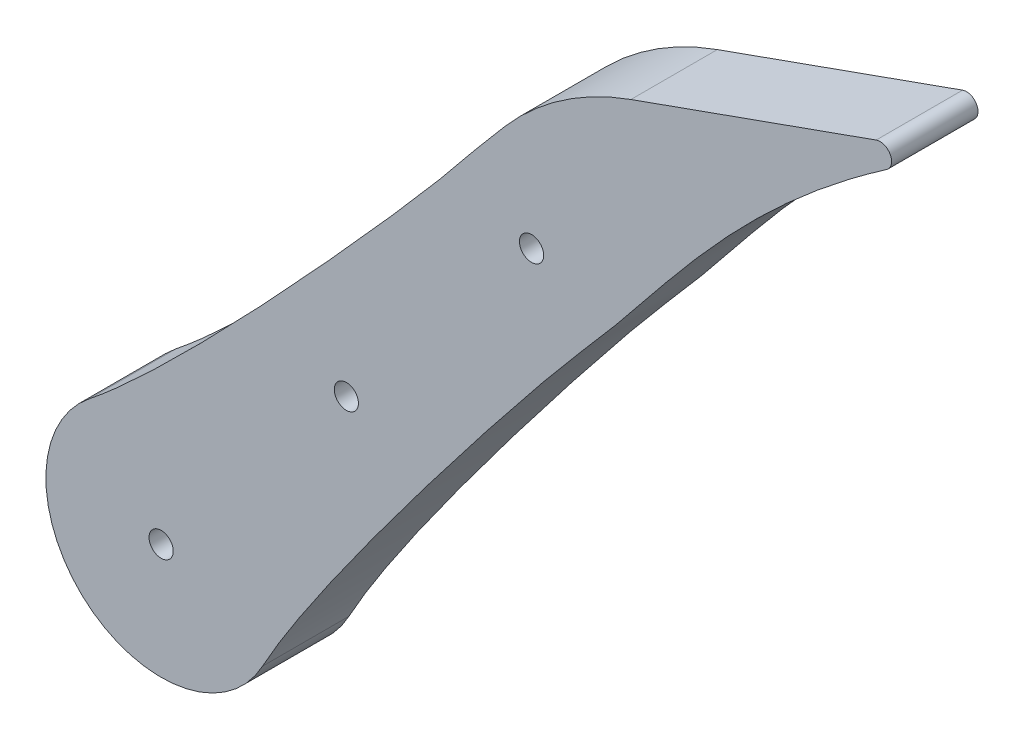
ISO-10303-21;
HEADER;
FILE_DESCRIPTION(('STEP AP214'),'2;1');
FILE_NAME('part.step','',(''),(''),'','','');
FILE_SCHEMA(('AUTOMOTIVE_DESIGN { 1 0 10303 214 1 1 1 1 }'));
ENDSEC;
DATA;
#1=APPLICATION_CONTEXT('core data for automotive mechanical design processes');
#2=APPLICATION_PROTOCOL_DEFINITION('international standard','automotive_design',2000,#1);
#3=PRODUCT_CONTEXT('',#1,'mechanical');
#4=PRODUCT('Part','Part','',(#3));
#5=PRODUCT_RELATED_PRODUCT_CATEGORY('part','',(#4));
#6=PRODUCT_DEFINITION_FORMATION('','',#4);
#7=PRODUCT_DEFINITION_CONTEXT('part definition',#1,'design');
#8=PRODUCT_DEFINITION('design','',#6,#7);
#9=PRODUCT_DEFINITION_SHAPE('','',#8);
#10=(LENGTH_UNIT() NAMED_UNIT(*) SI_UNIT(.MILLI.,.METRE.));
#11=(NAMED_UNIT(*) PLANE_ANGLE_UNIT() SI_UNIT($,.RADIAN.));
#12=(NAMED_UNIT(*) SI_UNIT($,.STERADIAN.) SOLID_ANGLE_UNIT());
#13=UNCERTAINTY_MEASURE_WITH_UNIT(LENGTH_MEASURE(1.E-05),#10,'distance_accuracy_value','');
#14=(GEOMETRIC_REPRESENTATION_CONTEXT(3) GLOBAL_UNCERTAINTY_ASSIGNED_CONTEXT((#13)) GLOBAL_UNIT_ASSIGNED_CONTEXT((#10,
#11,#12)) REPRESENTATION_CONTEXT('',''));
#15=CARTESIAN_POINT('',(0.,0.,0.));
#16=DIRECTION('',(0.,0.,1.));
#17=DIRECTION('',(1.,0.,0.));
#18=AXIS2_PLACEMENT_3D('',#15,#16,#17);
#19=CARTESIAN_POINT('',(76.5989589468399,-175.143739229266,31.));
#20=DIRECTION('',(0.,0.,1.));
#21=DIRECTION('',(1.,0.,0.));
#22=AXIS2_PLACEMENT_3D('',#19,#20,#21);
#23=PLANE('',#22);
#24=CARTESIAN_POINT('',(77.439461008357,-195.520152103908,31.));
#25=DIRECTION('',(0.,0.,1.));
#26=DIRECTION('',(1.,0.,0.));
#27=AXIS2_PLACEMENT_3D('',#24,#25,#26);
#28=CIRCLE('',#27,2.1);
#29=CARTESIAN_POINT('',(79.539461008357,-195.520152103908,31.));
#30=VERTEX_POINT('',#29);
#31=EDGE_CURVE('E140',#30,#30,#28,.T.);
#32=ORIENTED_EDGE('',*,*,#31,.F.);
#33=EDGE_LOOP('',(#32));
#34=FACE_BOUND('',#33,.T.);
#35=CARTESIAN_POINT('',(45.3000805240301,-233.822374259857,31.));
#36=DIRECTION('',(0.,0.,1.));
#37=DIRECTION('',(1.,0.,0.));
#38=AXIS2_PLACEMENT_3D('',#35,#36,#37);
#39=CIRCLE('',#38,2.09999999999999);
#40=CARTESIAN_POINT('',(47.4000805240301,-233.822374259857,31.));
#41=VERTEX_POINT('',#40);
#42=EDGE_CURVE('E218',#41,#41,#39,.T.);
#43=ORIENTED_EDGE('',*,*,#42,.F.);
#44=EDGE_LOOP('',(#43));
#45=FACE_BOUND('',#44,.T.);
#46=CARTESIAN_POINT('',(13.1607000397032,-272.124596415806,31.));
#47=DIRECTION('',(0.,0.,1.));
#48=DIRECTION('',(1.,0.,0.));
#49=AXIS2_PLACEMENT_3D('',#46,#47,#48);
#50=CIRCLE('',#49,2.09999999999999);
#51=CARTESIAN_POINT('',(15.2607000397032,-272.124596415806,31.));
#52=VERTEX_POINT('',#51);
#53=EDGE_CURVE('E226',#52,#52,#50,.T.);
#54=ORIENTED_EDGE('',*,*,#53,.F.);
#55=EDGE_LOOP('',(#54));
#56=FACE_BOUND('',#55,.T.);
#57=DIRECTION('',(-0.941840114679676,-0.336061301521278,0.));
#58=VECTOR('',#57,1.);
#59=CARTESIAN_POINT('',(62.7645024964508,-175.902806903005,31.));
#60=LINE('',#59,#58);
#61=CARTESIAN_POINT('',(137.236577428129,-149.33016252478,31.));
#62=VERTEX_POINT('',#61);
#63=CARTESIAN_POINT('',(94.678723233749,-164.515380957933,31.));
#64=VERTEX_POINT('',#63);
#65=EDGE_CURVE('E129',#62,#64,#60,.T.);
#66=ORIENTED_EDGE('',*,*,#65,.T.);
#67=CARTESIAN_POINT('',(112.153910912855,-213.491066921276,31.));
#68=DIRECTION('',(0.,0.,1.));
#69=DIRECTION('',(1.,0.,0.));
#70=AXIS2_PLACEMENT_3D('',#67,#68,#69);
#71=CIRCLE('',#70,52.);
#72=CARTESIAN_POINT('',(72.8806540117309,-179.408647811443,31.));
#73=VERTEX_POINT('',#72);
#74=EDGE_CURVE('E62',#64,#73,#71,.T.);
#75=ORIENTED_EDGE('',*,*,#74,.T.);
#76=CARTESIAN_POINT('',(115.704809965513,-109.996492831036,31.));
#77=CARTESIAN_POINT('',(101.948797579582,-150.116707378643,31.));
#78=CARTESIAN_POINT('',(78.1787907914669,-171.772825460758,31.));
#79=CARTESIAN_POINT('',(58.7170794777346,-197.082387324868,31.));
#80=CARTESIAN_POINT('',(16.3569995422659,-244.049515563768,31.));
#81=CARTESIAN_POINT('',(0.724486189959749,-256.461244760319,31.));
#82=B_SPLINE_CURVE_WITH_KNOTS('',3,(#76,#77,#78,#79,#80,#81),.UNSPECIFIED.,.F.,.F.,(4,1,1,4),
(0.,0.619090324128096,0.719090324128096,1.),.UNSPECIFIED.);
#83=CARTESIAN_POINT('',(0.724486189959779,-256.461244760319,31.));
#84=VERTEX_POINT('',#83);
#85=EDGE_CURVE('E88',#73,#84,#82,.T.);
#86=ORIENTED_EDGE('',*,*,#85,.T.);
#87=CARTESIAN_POINT('',(13.1607000397032,-272.124596415806,31.));
#88=DIRECTION('',(0.,0.,1.));
#89=DIRECTION('',(1.,0.,0.));
#90=AXIS2_PLACEMENT_3D('',#87,#88,#89);
#91=CIRCLE('',#90,20.);
#92=CARTESIAN_POINT('',(30.7456160602677,-281.651963762019,31.));
#93=VERTEX_POINT('',#92);
#94=EDGE_CURVE('E91',#84,#93,#91,.T.);
#95=ORIENTED_EDGE('',*,*,#94,.T.);
#96=CARTESIAN_POINT('',(30.7456160602677,-281.651963762019,31.));
#97=CARTESIAN_POINT('',(40.2542257453367,-264.101669256925,31.));
#98=CARTESIAN_POINT('',(79.1520670851047,-214.229377889324,31.));
#99=CARTESIAN_POINT('',(100.697629130312,-190.668374405424,31.));
#100=CARTESIAN_POINT('',(117.89712375584,-163.498941991036,31.));
#101=CARTESIAN_POINT('',(155.019115612056,-142.985112199041,31.));
#102=B_SPLINE_CURVE_WITH_KNOTS('',3,(#96,#97,#98,#99,#100,#101),.UNSPECIFIED.,.F.,.F.,(4,1,1,4),
(0.,0.280909675871904,0.380909675871904,1.),.UNSPECIFIED.);
#103=CARTESIAN_POINT('',(139.046001436581,-152.859000957248,31.));
#104=VERTEX_POINT('',#103);
#105=EDGE_CURVE('E103',#93,#104,#102,.T.);
#106=ORIENTED_EDGE('',*,*,#105,.T.);
#107=CARTESIAN_POINT('',(137.908700031171,-151.21384275414,31.));
#108=DIRECTION('',(0.,0.,1.));
#109=DIRECTION('',(1.,0.,0.));
#110=AXIS2_PLACEMENT_3D('',#107,#108,#109);
#111=CIRCLE('',#110,2.);
#112=EDGE_CURVE('E119',#104,#62,#111,.T.);
#113=ORIENTED_EDGE('',*,*,#112,.T.);
#114=EDGE_LOOP('',(#66,#75,#86,#95,#106,#113));
#115=FACE_BOUND('',#114,.T.);
#116=ADVANCED_FACE('F40',(#34,#45,#56,#115),#23,.T.);
#117=CARTESIAN_POINT('',(76.5989589468399,-175.143739229266,16.));
#118=DIRECTION('',(0.,0.,1.));
#119=DIRECTION('',(1.,0.,0.));
#120=AXIS2_PLACEMENT_3D('',#117,#118,#119);
#121=PLANE('',#120);
#122=CARTESIAN_POINT('',(77.439461008357,-195.520152103908,16.));
#123=DIRECTION('',(0.,0.,1.));
#124=DIRECTION('',(1.,0.,0.));
#125=AXIS2_PLACEMENT_3D('',#122,#123,#124);
#126=CIRCLE('',#125,2.1);
#127=CARTESIAN_POINT('',(79.539461008357,-195.520152103908,16.));
#128=VERTEX_POINT('',#127);
#129=EDGE_CURVE('E136',#128,#128,#126,.T.);
#130=ORIENTED_EDGE('',*,*,#129,.T.);
#131=EDGE_LOOP('',(#130));
#132=FACE_BOUND('',#131,.T.);
#133=CARTESIAN_POINT('',(45.3000805240301,-233.822374259857,16.));
#134=DIRECTION('',(0.,0.,1.));
#135=DIRECTION('',(1.,0.,0.));
#136=AXIS2_PLACEMENT_3D('',#133,#134,#135);
#137=CIRCLE('',#136,2.09999999999999);
#138=CARTESIAN_POINT('',(47.4000805240301,-233.822374259857,16.));
#139=VERTEX_POINT('',#138);
#140=EDGE_CURVE('E221',#139,#139,#137,.T.);
#141=ORIENTED_EDGE('',*,*,#140,.T.);
#142=EDGE_LOOP('',(#141));
#143=FACE_BOUND('',#142,.T.);
#144=CARTESIAN_POINT('',(13.1607000397032,-272.124596415806,16.));
#145=DIRECTION('',(0.,0.,1.));
#146=DIRECTION('',(1.,0.,0.));
#147=AXIS2_PLACEMENT_3D('',#144,#145,#146);
#148=CIRCLE('',#147,2.09999999999999);
#149=CARTESIAN_POINT('',(15.2607000397032,-272.124596415806,16.));
#150=VERTEX_POINT('',#149);
#151=EDGE_CURVE('E228',#150,#150,#148,.T.);
#152=ORIENTED_EDGE('',*,*,#151,.T.);
#153=EDGE_LOOP('',(#152));
#154=FACE_BOUND('',#153,.T.);
#155=CARTESIAN_POINT('',(115.704809965513,-109.996492831036,16.));
#156=CARTESIAN_POINT('',(101.948797579582,-150.116707378643,16.));
#157=CARTESIAN_POINT('',(78.1787907914669,-171.772825460758,16.));
#158=CARTESIAN_POINT('',(58.7170794777346,-197.082387324868,16.));
#159=CARTESIAN_POINT('',(16.3569995422659,-244.049515563768,16.));
#160=CARTESIAN_POINT('',(0.724486189959749,-256.461244760319,16.));
#161=B_SPLINE_CURVE_WITH_KNOTS('',3,(#155,#156,#157,#158,#159,#160),.UNSPECIFIED.,.F.,.F.,(4,1,
1,4),(0.,0.619090324128096,0.719090324128096,1.),.UNSPECIFIED.);
#162=CARTESIAN_POINT('',(72.8806540117309,-179.408647811443,16.));
#163=VERTEX_POINT('',#162);
#164=CARTESIAN_POINT('',(0.724486189959779,-256.461244760319,16.));
#165=VERTEX_POINT('',#164);
#166=EDGE_CURVE('E106',#163,#165,#161,.T.);
#167=ORIENTED_EDGE('',*,*,#166,.F.);
#168=CARTESIAN_POINT('',(112.153910912855,-213.491066921276,16.));
#169=DIRECTION('',(0.,0.,1.));
#170=DIRECTION('',(1.,0.,0.));
#171=AXIS2_PLACEMENT_3D('',#168,#169,#170);
#172=CIRCLE('',#171,52.);
#173=CARTESIAN_POINT('',(94.678723233749,-164.515380957933,16.));
#174=VERTEX_POINT('',#173);
#175=EDGE_CURVE('E12',#163,#174,#172,.F.);
#176=ORIENTED_EDGE('',*,*,#175,.T.);
#177=DIRECTION('',(-0.941840114679676,-0.336061301521278,0.));
#178=VECTOR('',#177,1.);
#179=CARTESIAN_POINT('',(62.7645024964508,-175.902806903005,16.));
#180=LINE('',#179,#178);
#181=CARTESIAN_POINT('',(137.236577428129,-149.33016252478,16.));
#182=VERTEX_POINT('',#181);
#183=EDGE_CURVE('E132',#182,#174,#180,.T.);
#184=ORIENTED_EDGE('',*,*,#183,.F.);
#185=CARTESIAN_POINT('',(137.908700031171,-151.21384275414,16.));
#186=DIRECTION('',(0.,0.,1.));
#187=DIRECTION('',(1.,0.,0.));
#188=AXIS2_PLACEMENT_3D('',#185,#186,#187);
#189=CIRCLE('',#188,2.);
#190=CARTESIAN_POINT('',(139.046001436581,-152.859000957248,16.));
#191=VERTEX_POINT('',#190);
#192=EDGE_CURVE('E111',#182,#191,#189,.F.);
#193=ORIENTED_EDGE('',*,*,#192,.T.);
#194=CARTESIAN_POINT('',(30.7456160602677,-281.651963762019,16.));
#195=CARTESIAN_POINT('',(40.2542257453367,-264.101669256925,16.));
#196=CARTESIAN_POINT('',(79.1520670851047,-214.229377889324,16.));
#197=CARTESIAN_POINT('',(100.697629130312,-190.668374405424,16.));
#198=CARTESIAN_POINT('',(117.89712375584,-163.498941991036,16.));
#199=CARTESIAN_POINT('',(155.019115612056,-142.985112199041,16.));
#200=B_SPLINE_CURVE_WITH_KNOTS('',3,(#194,#195,#196,#197,#198,#199),.UNSPECIFIED.,.F.,.F.,(4,1,
1,4),(0.,0.280909675871904,0.380909675871904,1.),.UNSPECIFIED.);
#201=CARTESIAN_POINT('',(30.7456160602677,-281.651963762019,16.));
#202=VERTEX_POINT('',#201);
#203=EDGE_CURVE('E94',#202,#191,#200,.T.);
#204=ORIENTED_EDGE('',*,*,#203,.F.);
#205=CARTESIAN_POINT('',(13.1607000397032,-272.124596415806,16.));
#206=DIRECTION('',(0.,0.,1.));
#207=DIRECTION('',(1.,0.,0.));
#208=AXIS2_PLACEMENT_3D('',#205,#206,#207);
#209=CIRCLE('',#208,20.);
#210=EDGE_CURVE('E191',#165,#202,#209,.T.);
#211=ORIENTED_EDGE('',*,*,#210,.F.);
#212=EDGE_LOOP('',(#167,#176,#184,#193,#204,#211));
#213=FACE_BOUND('',#212,.T.);
#214=ADVANCED_FACE('F153',(#132,#143,#154,#213),#121,.F.);
#215=DIRECTION('',(0.,0.,-1.));
#216=VECTOR('',#215,1.);
#217=SURFACE_OF_LINEAR_EXTRUSION('',#82,#216);
#218=ORIENTED_EDGE('',*,*,#85,.F.);
#219=DIRECTION('',(0.,0.,-1.));
#220=VECTOR('',#219,1.);
#221=CARTESIAN_POINT('',(72.8806540117309,-179.408647811443,31.));
#222=LINE('',#221,#220);
#223=EDGE_CURVE('E48',#73,#163,#222,.T.);
#224=ORIENTED_EDGE('',*,*,#223,.T.);
#225=ORIENTED_EDGE('',*,*,#166,.T.);
#226=DIRECTION('',(0.,0.,-1.));
#227=VECTOR('',#226,1.);
#228=CARTESIAN_POINT('',(0.724486189959779,-256.461244760319,31.));
#229=LINE('',#228,#227);
#230=EDGE_CURVE('E99',#84,#165,#229,.T.);
#231=ORIENTED_EDGE('',*,*,#230,.F.);
#232=EDGE_LOOP('',(#218,#224,#225,#231));
#233=FACE_BOUND('',#232,.T.);
#234=ADVANCED_FACE('F105',(#233),#217,.F.);
#235=CARTESIAN_POINT('',(13.1607000397032,-272.124596415806,31.));
#236=DIRECTION('',(0.,0.,-1.));
#237=DIRECTION('',(-1.,0.,0.));
#238=AXIS2_PLACEMENT_3D('',#235,#236,#237);
#239=CYLINDRICAL_SURFACE('',#238,20.);
#240=ORIENTED_EDGE('',*,*,#210,.T.);
#241=DIRECTION('',(0.,0.,-1.));
#242=VECTOR('',#241,1.);
#243=CARTESIAN_POINT('',(30.7456160602677,-281.651963762019,31.));
#244=LINE('',#243,#242);
#245=EDGE_CURVE('E101',#93,#202,#244,.T.);
#246=ORIENTED_EDGE('',*,*,#245,.F.);
#247=ORIENTED_EDGE('',*,*,#94,.F.);
#248=ORIENTED_EDGE('',*,*,#230,.T.);
#249=EDGE_LOOP('',(#240,#246,#247,#248));
#250=FACE_BOUND('',#249,.T.);
#251=ADVANCED_FACE('F98',(#250),#239,.T.);
#252=DIRECTION('',(0.,0.,-1.));
#253=VECTOR('',#252,1.);
#254=SURFACE_OF_LINEAR_EXTRUSION('',#102,#253);
#255=ORIENTED_EDGE('',*,*,#203,.T.);
#256=DIRECTION('',(0.,0.,-1.));
#257=VECTOR('',#256,1.);
#258=CARTESIAN_POINT('',(139.046001436581,-152.859000957248,16.));
#259=LINE('',#258,#257);
#260=EDGE_CURVE('E117',#191,#104,#259,.F.);
#261=ORIENTED_EDGE('',*,*,#260,.T.);
#262=ORIENTED_EDGE('',*,*,#105,.F.);
#263=ORIENTED_EDGE('',*,*,#245,.T.);
#264=EDGE_LOOP('',(#255,#261,#262,#263));
#265=FACE_BOUND('',#264,.T.);
#266=ADVANCED_FACE('F167',(#265),#254,.F.);
#267=CARTESIAN_POINT('',(62.7645024964508,-175.902806903005,16.));
#268=DIRECTION('',(-0.336061301521278,0.941840114679676,0.));
#269=DIRECTION('',(-0.941840114679676,-0.336061301521278,0.));
#270=AXIS2_PLACEMENT_3D('',#267,#268,#269);
#271=PLANE('',#270);
#272=ORIENTED_EDGE('',*,*,#183,.T.);
#273=DIRECTION('',(0.,0.,1.));
#274=VECTOR('',#273,1.);
#275=CARTESIAN_POINT('',(94.678723233749,-164.515380957933,31.));
#276=LINE('',#275,#274);
#277=EDGE_CURVE('E121',#174,#64,#276,.T.);
#278=ORIENTED_EDGE('',*,*,#277,.T.);
#279=ORIENTED_EDGE('',*,*,#65,.F.);
#280=DIRECTION('',(0.,0.,1.));
#281=VECTOR('',#280,1.);
#282=CARTESIAN_POINT('',(137.236577428129,-149.33016252478,16.));
#283=LINE('',#282,#281);
#284=EDGE_CURVE('E108',#62,#182,#283,.F.);
#285=ORIENTED_EDGE('',*,*,#284,.T.);
#286=EDGE_LOOP('',(#272,#278,#279,#285));
#287=FACE_BOUND('',#286,.T.);
#288=ADVANCED_FACE('F128',(#287),#271,.T.);
#289=CARTESIAN_POINT('',(137.908700031171,-151.21384275414,23.5));
#290=DIRECTION('',(0.,0.,-1.));
#291=DIRECTION('',(-1.,0.,0.));
#292=AXIS2_PLACEMENT_3D('',#289,#290,#291);
#293=CYLINDRICAL_SURFACE('',#292,2.);
#294=ORIENTED_EDGE('',*,*,#112,.F.);
#295=ORIENTED_EDGE('',*,*,#260,.F.);
#296=ORIENTED_EDGE('',*,*,#192,.F.);
#297=ORIENTED_EDGE('',*,*,#284,.F.);
#298=EDGE_LOOP('',(#294,#295,#296,#297));
#299=FACE_BOUND('',#298,.T.);
#300=ADVANCED_FACE('F155',(#299),#293,.T.);
#301=CARTESIAN_POINT('',(13.1607000397032,-272.124596415806,16.));
#302=DIRECTION('',(0.,0.,1.));
#303=DIRECTION('',(1.,0.,0.));
#304=AXIS2_PLACEMENT_3D('',#301,#302,#303);
#305=CYLINDRICAL_SURFACE('',#304,2.09999999999999);
#306=ORIENTED_EDGE('',*,*,#151,.F.);
#307=EDGE_LOOP('',(#306));
#308=FACE_BOUND('',#307,.T.);
#309=ORIENTED_EDGE('',*,*,#53,.T.);
#310=EDGE_LOOP('',(#309));
#311=FACE_BOUND('',#310,.T.);
#312=ADVANCED_FACE('F157',(#308,#311),#305,.F.);
#313=CARTESIAN_POINT('',(45.3000805240301,-233.822374259857,16.));
#314=DIRECTION('',(0.,0.,1.));
#315=DIRECTION('',(1.,0.,0.));
#316=AXIS2_PLACEMENT_3D('',#313,#314,#315);
#317=CYLINDRICAL_SURFACE('',#316,2.09999999999999);
#318=ORIENTED_EDGE('',*,*,#140,.F.);
#319=EDGE_LOOP('',(#318));
#320=FACE_BOUND('',#319,.T.);
#321=ORIENTED_EDGE('',*,*,#42,.T.);
#322=EDGE_LOOP('',(#321));
#323=FACE_BOUND('',#322,.T.);
#324=ADVANCED_FACE('F163',(#320,#323),#317,.F.);
#325=CARTESIAN_POINT('',(77.439461008357,-195.520152103908,16.));
#326=DIRECTION('',(0.,0.,1.));
#327=DIRECTION('',(1.,0.,0.));
#328=AXIS2_PLACEMENT_3D('',#325,#326,#327);
#329=CYLINDRICAL_SURFACE('',#328,2.1);
#330=ORIENTED_EDGE('',*,*,#129,.F.);
#331=EDGE_LOOP('',(#330));
#332=FACE_BOUND('',#331,.T.);
#333=ORIENTED_EDGE('',*,*,#31,.T.);
#334=EDGE_LOOP('',(#333));
#335=FACE_BOUND('',#334,.T.);
#336=ADVANCED_FACE('F205',(#332,#335),#329,.F.);
#337=CARTESIAN_POINT('',(112.153910912855,-213.491066921276,23.5));
#338=DIRECTION('',(0.,0.,-1.));
#339=DIRECTION('',(-1.,0.,0.));
#340=AXIS2_PLACEMENT_3D('',#337,#338,#339);
#341=CYLINDRICAL_SURFACE('',#340,52.);
#342=ORIENTED_EDGE('',*,*,#175,.F.);
#343=ORIENTED_EDGE('',*,*,#223,.F.);
#344=ORIENTED_EDGE('',*,*,#74,.F.);
#345=ORIENTED_EDGE('',*,*,#277,.F.);
#346=EDGE_LOOP('',(#342,#343,#344,#345));
#347=FACE_BOUND('',#346,.T.);
#348=ADVANCED_FACE('F42',(#347),#341,.T.);
#349=CLOSED_SHELL('',(#116,#214,#234,#251,#266,#288,#300,#312,#324,#336,#348));
#350=MANIFOLD_SOLID_BREP('B2',#349);
#351=ADVANCED_BREP_SHAPE_REPRESENTATION('',(#18,#350),#14);
#352=SHAPE_DEFINITION_REPRESENTATION(#9,#351);
ENDSEC;
END-ISO-10303-21;
